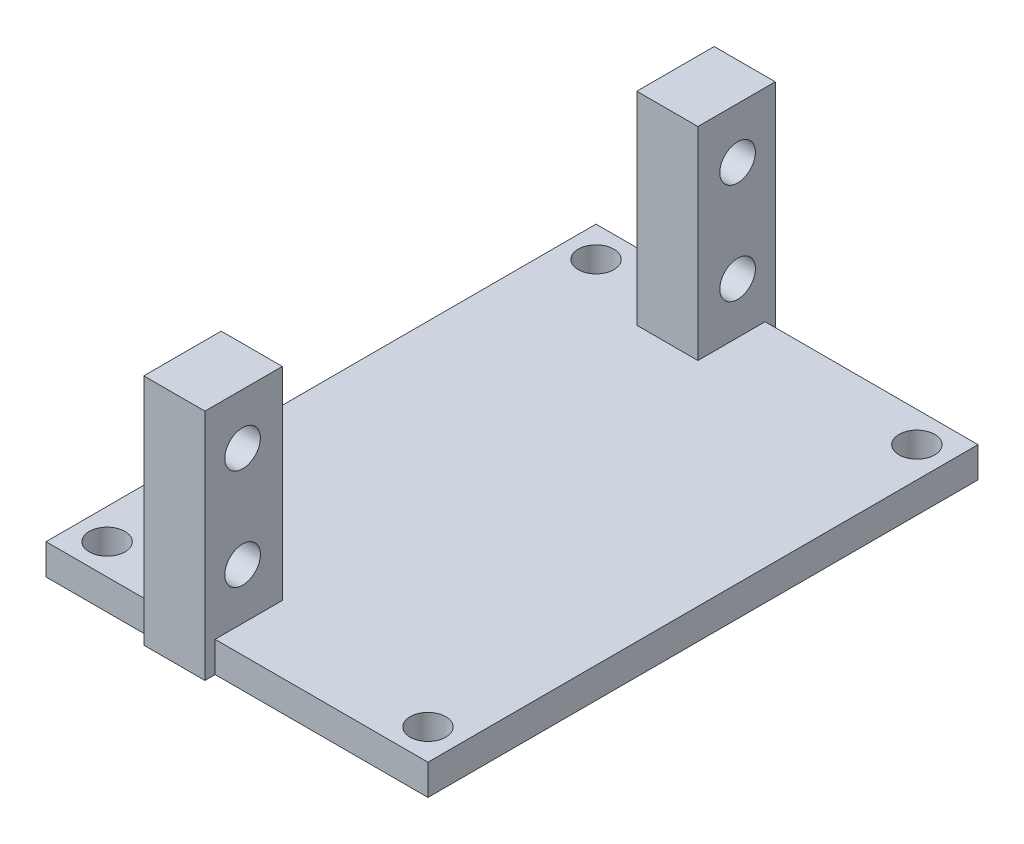
ISO-10303-21;
HEADER;
FILE_DESCRIPTION(('STEP AP214'),'2;1');
FILE_NAME('part.step','',(''),(''),'','','');
FILE_SCHEMA(('AUTOMOTIVE_DESIGN { 1 0 10303 214 1 1 1 1 }'));
ENDSEC;
DATA;
#1=APPLICATION_CONTEXT('core data for automotive mechanical design processes');
#2=APPLICATION_PROTOCOL_DEFINITION('international standard','automotive_design',2000,#1);
#3=PRODUCT_CONTEXT('',#1,'mechanical');
#4=PRODUCT('Part','Part','',(#3));
#5=PRODUCT_RELATED_PRODUCT_CATEGORY('part','',(#4));
#6=PRODUCT_DEFINITION_FORMATION('','',#4);
#7=PRODUCT_DEFINITION_CONTEXT('part definition',#1,'design');
#8=PRODUCT_DEFINITION('design','',#6,#7);
#9=PRODUCT_DEFINITION_SHAPE('','',#8);
#10=(LENGTH_UNIT() NAMED_UNIT(*) SI_UNIT(.MILLI.,.METRE.));
#11=(NAMED_UNIT(*) PLANE_ANGLE_UNIT() SI_UNIT($,.RADIAN.));
#12=(NAMED_UNIT(*) SI_UNIT($,.STERADIAN.) SOLID_ANGLE_UNIT());
#13=UNCERTAINTY_MEASURE_WITH_UNIT(LENGTH_MEASURE(1.E-05),#10,'distance_accuracy_value','');
#14=(GEOMETRIC_REPRESENTATION_CONTEXT(3) GLOBAL_UNCERTAINTY_ASSIGNED_CONTEXT((#13)) GLOBAL_UNIT_ASSIGNED_CONTEXT((#10,
#11,#12)) REPRESENTATION_CONTEXT('',''));
#15=CARTESIAN_POINT('',(0.,0.,0.));
#16=DIRECTION('',(0.,0.,1.));
#17=DIRECTION('',(1.,0.,0.));
#18=AXIS2_PLACEMENT_3D('',#15,#16,#17);
#19=CARTESIAN_POINT('',(-18.75,3.,-27.));
#20=DIRECTION('',(0.,0.,1.));
#21=DIRECTION('',(1.,0.,0.));
#22=AXIS2_PLACEMENT_3D('',#19,#20,#21);
#23=PLANE('',#22);
#24=DIRECTION('',(-1.,0.,0.));
#25=VECTOR('',#24,1.);
#26=CARTESIAN_POINT('',(-18.75,0.,-27.));
#27=LINE('',#26,#25);
#28=CARTESIAN_POINT('',(18.75,0.,-27.));
#29=VERTEX_POINT('',#28);
#30=CARTESIAN_POINT('',(-2.15,0.,-27.));
#31=VERTEX_POINT('',#30);
#32=EDGE_CURVE('E265',#29,#31,#27,.T.);
#33=ORIENTED_EDGE('',*,*,#32,.T.);
#34=DIRECTION('',(0.,1.,0.));
#35=VECTOR('',#34,1.);
#36=CARTESIAN_POINT('',(-2.14999999999999,3.,-27.));
#37=LINE('',#36,#35);
#38=CARTESIAN_POINT('',(-2.15,3.,-27.));
#39=VERTEX_POINT('',#38);
#40=EDGE_CURVE('E204',#31,#39,#37,.T.);
#41=ORIENTED_EDGE('',*,*,#40,.T.);
#42=DIRECTION('',(-1.,0.,0.));
#43=VECTOR('',#42,1.);
#44=CARTESIAN_POINT('',(-18.75,3.,-27.));
#45=LINE('',#44,#43);
#46=CARTESIAN_POINT('',(18.75,3.,-27.));
#47=VERTEX_POINT('',#46);
#48=EDGE_CURVE('E253',#47,#39,#45,.T.);
#49=ORIENTED_EDGE('',*,*,#48,.F.);
#50=DIRECTION('',(0.,-1.,0.));
#51=VECTOR('',#50,1.);
#52=CARTESIAN_POINT('',(18.75,3.,-27.));
#53=LINE('',#52,#51);
#54=EDGE_CURVE('E11',#47,#29,#53,.T.);
#55=ORIENTED_EDGE('',*,*,#54,.T.);
#56=EDGE_LOOP('',(#33,#41,#49,#55));
#57=FACE_BOUND('',#56,.T.);
#58=ADVANCED_FACE('F37',(#57),#23,.F.);
#59=CARTESIAN_POINT('',(-18.75,3.,27.));
#60=DIRECTION('',(0.,0.,-1.));
#61=DIRECTION('',(-1.,0.,0.));
#62=AXIS2_PLACEMENT_3D('',#59,#60,#61);
#63=PLANE('',#62);
#64=DIRECTION('',(1.,0.,0.));
#65=VECTOR('',#64,1.);
#66=CARTESIAN_POINT('',(-18.75,3.,27.));
#67=LINE('',#66,#65);
#68=CARTESIAN_POINT('',(-2.15,3.,27.));
#69=VERTEX_POINT('',#68);
#70=CARTESIAN_POINT('',(18.75,3.,27.));
#71=VERTEX_POINT('',#70);
#72=EDGE_CURVE('E257',#69,#71,#67,.T.);
#73=ORIENTED_EDGE('',*,*,#72,.F.);
#74=DIRECTION('',(0.,-1.,0.));
#75=VECTOR('',#74,1.);
#76=CARTESIAN_POINT('',(-2.15,3.,27.));
#77=LINE('',#76,#75);
#78=CARTESIAN_POINT('',(-2.15,0.,27.));
#79=VERTEX_POINT('',#78);
#80=EDGE_CURVE('E245',#69,#79,#77,.T.);
#81=ORIENTED_EDGE('',*,*,#80,.T.);
#82=DIRECTION('',(1.,0.,0.));
#83=VECTOR('',#82,1.);
#84=CARTESIAN_POINT('',(-18.75,0.,27.));
#85=LINE('',#84,#83);
#86=CARTESIAN_POINT('',(18.75,0.,27.));
#87=VERTEX_POINT('',#86);
#88=EDGE_CURVE('E269',#79,#87,#85,.T.);
#89=ORIENTED_EDGE('',*,*,#88,.T.);
#90=DIRECTION('',(0.,-1.,0.));
#91=VECTOR('',#90,1.);
#92=CARTESIAN_POINT('',(18.75,3.,27.));
#93=LINE('',#92,#91);
#94=EDGE_CURVE('E261',#71,#87,#93,.T.);
#95=ORIENTED_EDGE('',*,*,#94,.F.);
#96=EDGE_LOOP('',(#73,#81,#89,#95));
#97=FACE_BOUND('',#96,.T.);
#98=ADVANCED_FACE('F325',(#97),#63,.F.);
#99=CARTESIAN_POINT('',(18.75,3.,-27.));
#100=DIRECTION('',(-1.,0.,0.));
#101=DIRECTION('',(0.,0.,1.));
#102=AXIS2_PLACEMENT_3D('',#99,#100,#101);
#103=PLANE('',#102);
#104=DIRECTION('',(0.,0.,-1.));
#105=VECTOR('',#104,1.);
#106=CARTESIAN_POINT('',(18.75,0.,-27.));
#107=LINE('',#106,#105);
#108=EDGE_CURVE('E247',#87,#29,#107,.T.);
#109=ORIENTED_EDGE('',*,*,#108,.T.);
#110=ORIENTED_EDGE('',*,*,#54,.F.);
#111=DIRECTION('',(0.,0.,-1.));
#112=VECTOR('',#111,1.);
#113=CARTESIAN_POINT('',(18.75,3.,-27.));
#114=LINE('',#113,#112);
#115=EDGE_CURVE('E248',#71,#47,#114,.T.);
#116=ORIENTED_EDGE('',*,*,#115,.F.);
#117=ORIENTED_EDGE('',*,*,#94,.T.);
#118=EDGE_LOOP('',(#109,#110,#116,#117));
#119=FACE_BOUND('',#118,.T.);
#120=ADVANCED_FACE('F39',(#119),#103,.F.);
#121=CARTESIAN_POINT('',(-8.15,3.,-27.));
#122=VERTEX_POINT('',#121);
#123=CARTESIAN_POINT('',(-18.75,3.,-27.));
#124=VERTEX_POINT('',#123);
#125=EDGE_CURVE('E251',#122,#124,#45,.T.);
#126=ORIENTED_EDGE('',*,*,#125,.F.);
#127=DIRECTION('',(0.,-1.,0.));
#128=VECTOR('',#127,1.);
#129=CARTESIAN_POINT('',(-8.15,3.,-27.));
#130=LINE('',#129,#128);
#131=CARTESIAN_POINT('',(-8.15,0.,-27.));
#132=VERTEX_POINT('',#131);
#133=EDGE_CURVE('E199',#122,#132,#130,.T.);
#134=ORIENTED_EDGE('',*,*,#133,.T.);
#135=CARTESIAN_POINT('',(-18.75,0.,-27.));
#136=VERTEX_POINT('',#135);
#137=EDGE_CURVE('E264',#132,#136,#27,.T.);
#138=ORIENTED_EDGE('',*,*,#137,.T.);
#139=DIRECTION('',(0.,-1.,0.));
#140=VECTOR('',#139,1.);
#141=CARTESIAN_POINT('',(-18.75,3.,-27.));
#142=LINE('',#141,#140);
#143=EDGE_CURVE('E46',#124,#136,#142,.T.);
#144=ORIENTED_EDGE('',*,*,#143,.F.);
#145=EDGE_LOOP('',(#126,#134,#138,#144));
#146=FACE_BOUND('',#145,.T.);
#147=ADVANCED_FACE('F340',(#146),#23,.F.);
#148=CARTESIAN_POINT('',(-18.75,3.,-27.));
#149=DIRECTION('',(1.,0.,0.));
#150=DIRECTION('',(0.,0.,-1.));
#151=AXIS2_PLACEMENT_3D('',#148,#149,#150);
#152=PLANE('',#151);
#153=DIRECTION('',(0.,0.,1.));
#154=VECTOR('',#153,1.);
#155=CARTESIAN_POINT('',(-18.75,0.,-27.));
#156=LINE('',#155,#154);
#157=CARTESIAN_POINT('',(-18.75,0.,27.));
#158=VERTEX_POINT('',#157);
#159=EDGE_CURVE('E267',#136,#158,#156,.T.);
#160=ORIENTED_EDGE('',*,*,#159,.T.);
#161=DIRECTION('',(0.,-1.,0.));
#162=VECTOR('',#161,1.);
#163=CARTESIAN_POINT('',(-18.75,3.,27.));
#164=LINE('',#163,#162);
#165=CARTESIAN_POINT('',(-18.75,3.,27.));
#166=VERTEX_POINT('',#165);
#167=EDGE_CURVE('E273',#166,#158,#164,.T.);
#168=ORIENTED_EDGE('',*,*,#167,.F.);
#169=DIRECTION('',(0.,0.,1.));
#170=VECTOR('',#169,1.);
#171=CARTESIAN_POINT('',(-18.75,3.,-27.));
#172=LINE('',#171,#170);
#173=EDGE_CURVE('E255',#124,#166,#172,.T.);
#174=ORIENTED_EDGE('',*,*,#173,.F.);
#175=ORIENTED_EDGE('',*,*,#143,.T.);
#176=EDGE_LOOP('',(#160,#168,#174,#175));
#177=FACE_BOUND('',#176,.T.);
#178=ADVANCED_FACE('F344',(#177),#152,.F.);
#179=CARTESIAN_POINT('',(-8.15,0.,27.));
#180=VERTEX_POINT('',#179);
#181=EDGE_CURVE('E252',#158,#180,#85,.T.);
#182=ORIENTED_EDGE('',*,*,#181,.T.);
#183=DIRECTION('',(0.,1.,0.));
#184=VECTOR('',#183,1.);
#185=CARTESIAN_POINT('',(-8.14999999999999,3.,27.));
#186=LINE('',#185,#184);
#187=CARTESIAN_POINT('',(-8.15,3.,27.));
#188=VERTEX_POINT('',#187);
#189=EDGE_CURVE('E240',#180,#188,#186,.T.);
#190=ORIENTED_EDGE('',*,*,#189,.T.);
#191=EDGE_CURVE('E258',#166,#188,#67,.T.);
#192=ORIENTED_EDGE('',*,*,#191,.F.);
#193=ORIENTED_EDGE('',*,*,#167,.T.);
#194=EDGE_LOOP('',(#182,#190,#192,#193));
#195=FACE_BOUND('',#194,.T.);
#196=ADVANCED_FACE('F346',(#195),#63,.F.);
#197=CARTESIAN_POINT('',(0.,3.,0.));
#198=DIRECTION('',(0.,1.,0.));
#199=DIRECTION('',(0.,0.,1.));
#200=AXIS2_PLACEMENT_3D('',#197,#198,#199);
#201=PLANE('',#200);
#202=CARTESIAN_POINT('',(15.75,3.,-24.));
#203=DIRECTION('',(0.,1.,0.));
#204=DIRECTION('',(0.,0.,1.));
#205=AXIS2_PLACEMENT_3D('',#202,#203,#204);
#206=CIRCLE('',#205,1.75);
#207=CARTESIAN_POINT('',(15.75,3.,-22.25));
#208=VERTEX_POINT('',#207);
#209=EDGE_CURVE('E568',#208,#208,#206,.T.);
#210=ORIENTED_EDGE('',*,*,#209,.F.);
#211=EDGE_LOOP('',(#210));
#212=FACE_BOUND('',#211,.T.);
#213=CARTESIAN_POINT('',(15.75,3.,24.));
#214=DIRECTION('',(0.,1.,0.));
#215=DIRECTION('',(0.,0.,1.));
#216=AXIS2_PLACEMENT_3D('',#213,#214,#215);
#217=CIRCLE('',#216,1.75);
#218=CARTESIAN_POINT('',(15.75,3.,25.75));
#219=VERTEX_POINT('',#218);
#220=EDGE_CURVE('E570',#219,#219,#217,.T.);
#221=ORIENTED_EDGE('',*,*,#220,.F.);
#222=EDGE_LOOP('',(#221));
#223=FACE_BOUND('',#222,.T.);
#224=CARTESIAN_POINT('',(-15.75,3.,24.));
#225=DIRECTION('',(0.,1.,0.));
#226=DIRECTION('',(0.,0.,1.));
#227=AXIS2_PLACEMENT_3D('',#224,#225,#226);
#228=CIRCLE('',#227,1.75);
#229=CARTESIAN_POINT('',(-15.75,3.,25.75));
#230=VERTEX_POINT('',#229);
#231=EDGE_CURVE('E601',#230,#230,#228,.T.);
#232=ORIENTED_EDGE('',*,*,#231,.F.);
#233=EDGE_LOOP('',(#232));
#234=FACE_BOUND('',#233,.T.);
#235=CARTESIAN_POINT('',(-15.75,3.,-24.));
#236=DIRECTION('',(0.,1.,0.));
#237=DIRECTION('',(0.,0.,1.));
#238=AXIS2_PLACEMENT_3D('',#235,#236,#237);
#239=CIRCLE('',#238,1.75);
#240=CARTESIAN_POINT('',(-15.75,3.,-22.25));
#241=VERTEX_POINT('',#240);
#242=EDGE_CURVE('E578',#241,#241,#239,.T.);
#243=ORIENTED_EDGE('',*,*,#242,.F.);
#244=EDGE_LOOP('',(#243));
#245=FACE_BOUND('',#244,.T.);
#246=DIRECTION('',(0.,0.,-1.));
#247=VECTOR('',#246,1.);
#248=CARTESIAN_POINT('',(-2.15000000000001,3.,0.));
#249=LINE('',#248,#247);
#250=CARTESIAN_POINT('',(-2.15,3.,-20.4));
#251=VERTEX_POINT('',#250);
#252=EDGE_CURVE('E54',#251,#39,#249,.T.);
#253=ORIENTED_EDGE('',*,*,#252,.F.);
#254=DIRECTION('',(1.,0.,0.));
#255=VECTOR('',#254,1.);
#256=CARTESIAN_POINT('',(0.,3.,-20.4));
#257=LINE('',#256,#255);
#258=CARTESIAN_POINT('',(-8.15,3.,-20.4));
#259=VERTEX_POINT('',#258);
#260=EDGE_CURVE('E201',#259,#251,#257,.T.);
#261=ORIENTED_EDGE('',*,*,#260,.F.);
#262=DIRECTION('',(0.,0.,1.));
#263=VECTOR('',#262,1.);
#264=CARTESIAN_POINT('',(-8.15,3.,0.));
#265=LINE('',#264,#263);
#266=EDGE_CURVE('E60',#122,#259,#265,.T.);
#267=ORIENTED_EDGE('',*,*,#266,.F.);
#268=ORIENTED_EDGE('',*,*,#125,.T.);
#269=ORIENTED_EDGE('',*,*,#173,.T.);
#270=ORIENTED_EDGE('',*,*,#191,.T.);
#271=DIRECTION('',(0.,0.,1.));
#272=VECTOR('',#271,1.);
#273=CARTESIAN_POINT('',(-8.15000000000001,3.,0.));
#274=LINE('',#273,#272);
#275=CARTESIAN_POINT('',(-8.15,3.,20.4));
#276=VERTEX_POINT('',#275);
#277=EDGE_CURVE('E237',#276,#188,#274,.T.);
#278=ORIENTED_EDGE('',*,*,#277,.F.);
#279=DIRECTION('',(-1.,0.,0.));
#280=VECTOR('',#279,1.);
#281=CARTESIAN_POINT('',(0.,3.,20.4));
#282=LINE('',#281,#280);
#283=CARTESIAN_POINT('',(-2.15,3.,20.4));
#284=VERTEX_POINT('',#283);
#285=EDGE_CURVE('E229',#284,#276,#282,.T.);
#286=ORIENTED_EDGE('',*,*,#285,.F.);
#287=DIRECTION('',(0.,0.,-1.));
#288=VECTOR('',#287,1.);
#289=CARTESIAN_POINT('',(-2.15000000000001,3.,0.));
#290=LINE('',#289,#288);
#291=EDGE_CURVE('E242',#69,#284,#290,.T.);
#292=ORIENTED_EDGE('',*,*,#291,.F.);
#293=ORIENTED_EDGE('',*,*,#72,.T.);
#294=ORIENTED_EDGE('',*,*,#115,.T.);
#295=ORIENTED_EDGE('',*,*,#48,.T.);
#296=EDGE_LOOP('',(#253,#261,#267,#268,#269,#270,#278,#286,#292,#293,#294,#295));
#297=FACE_BOUND('',#296,.T.);
#298=ADVANCED_FACE('F320',(#212,#223,#234,#245,#297),#201,.T.);
#299=CARTESIAN_POINT('',(0.,0.,0.));
#300=DIRECTION('',(0.,1.,0.));
#301=DIRECTION('',(0.,0.,1.));
#302=AXIS2_PLACEMENT_3D('',#299,#300,#301);
#303=PLANE('',#302);
#304=CARTESIAN_POINT('',(15.75,0.,-24.));
#305=DIRECTION('',(0.,1.,0.));
#306=DIRECTION('',(0.,0.,1.));
#307=AXIS2_PLACEMENT_3D('',#304,#305,#306);
#308=CIRCLE('',#307,1.75);
#309=CARTESIAN_POINT('',(15.75,0.,-22.25));
#310=VERTEX_POINT('',#309);
#311=EDGE_CURVE('E565',#310,#310,#308,.T.);
#312=ORIENTED_EDGE('',*,*,#311,.T.);
#313=EDGE_LOOP('',(#312));
#314=FACE_BOUND('',#313,.T.);
#315=CARTESIAN_POINT('',(15.75,0.,24.));
#316=DIRECTION('',(0.,1.,0.));
#317=DIRECTION('',(0.,0.,1.));
#318=AXIS2_PLACEMENT_3D('',#315,#316,#317);
#319=CIRCLE('',#318,1.75);
#320=CARTESIAN_POINT('',(15.75,0.,25.75));
#321=VERTEX_POINT('',#320);
#322=EDGE_CURVE('E606',#321,#321,#319,.T.);
#323=ORIENTED_EDGE('',*,*,#322,.T.);
#324=EDGE_LOOP('',(#323));
#325=FACE_BOUND('',#324,.T.);
#326=CARTESIAN_POINT('',(-15.75,0.,24.));
#327=DIRECTION('',(0.,1.,0.));
#328=DIRECTION('',(0.,0.,1.));
#329=AXIS2_PLACEMENT_3D('',#326,#327,#328);
#330=CIRCLE('',#329,1.75);
#331=CARTESIAN_POINT('',(-15.75,0.,25.75));
#332=VERTEX_POINT('',#331);
#333=EDGE_CURVE('E581',#332,#332,#330,.T.);
#334=ORIENTED_EDGE('',*,*,#333,.T.);
#335=EDGE_LOOP('',(#334));
#336=FACE_BOUND('',#335,.T.);
#337=CARTESIAN_POINT('',(-15.75,0.,-24.));
#338=DIRECTION('',(0.,1.,0.));
#339=DIRECTION('',(0.,0.,1.));
#340=AXIS2_PLACEMENT_3D('',#337,#338,#339);
#341=CIRCLE('',#340,1.75);
#342=CARTESIAN_POINT('',(-15.75,0.,-22.25));
#343=VERTEX_POINT('',#342);
#344=EDGE_CURVE('E574',#343,#343,#341,.T.);
#345=ORIENTED_EDGE('',*,*,#344,.T.);
#346=EDGE_LOOP('',(#345));
#347=FACE_BOUND('',#346,.T.);
#348=ORIENTED_EDGE('',*,*,#137,.F.);
#349=DIRECTION('',(0.,0.,1.));
#350=VECTOR('',#349,1.);
#351=CARTESIAN_POINT('',(-8.15,0.,-28.));
#352=LINE('',#351,#350);
#353=CARTESIAN_POINT('',(-8.15,0.,-28.));
#354=VERTEX_POINT('',#353);
#355=EDGE_CURVE('E165',#354,#132,#352,.T.);
#356=ORIENTED_EDGE('',*,*,#355,.F.);
#357=DIRECTION('',(-1.,0.,0.));
#358=VECTOR('',#357,1.);
#359=CARTESIAN_POINT('',(-2.14999999999999,0.,-28.));
#360=LINE('',#359,#358);
#361=CARTESIAN_POINT('',(-2.14999999999999,0.,-28.));
#362=VERTEX_POINT('',#361);
#363=EDGE_CURVE('E189',#362,#354,#360,.T.);
#364=ORIENTED_EDGE('',*,*,#363,.F.);
#365=DIRECTION('',(0.,0.,-1.));
#366=VECTOR('',#365,1.);
#367=CARTESIAN_POINT('',(-2.14999999999999,0.,-28.));
#368=LINE('',#367,#366);
#369=EDGE_CURVE('E160',#31,#362,#368,.T.);
#370=ORIENTED_EDGE('',*,*,#369,.F.);
#371=ORIENTED_EDGE('',*,*,#32,.F.);
#372=ORIENTED_EDGE('',*,*,#108,.F.);
#373=ORIENTED_EDGE('',*,*,#88,.F.);
#374=DIRECTION('',(0.,0.,-1.));
#375=VECTOR('',#374,1.);
#376=CARTESIAN_POINT('',(-2.14999999999999,0.,28.));
#377=LINE('',#376,#375);
#378=CARTESIAN_POINT('',(-2.14999999999999,0.,28.));
#379=VERTEX_POINT('',#378);
#380=EDGE_CURVE('E218',#379,#79,#377,.T.);
#381=ORIENTED_EDGE('',*,*,#380,.F.);
#382=DIRECTION('',(1.,0.,0.));
#383=VECTOR('',#382,1.);
#384=CARTESIAN_POINT('',(-2.14999999999999,0.,28.));
#385=LINE('',#384,#383);
#386=CARTESIAN_POINT('',(-8.14999999999999,0.,28.));
#387=VERTEX_POINT('',#386);
#388=EDGE_CURVE('E223',#387,#379,#385,.T.);
#389=ORIENTED_EDGE('',*,*,#388,.F.);
#390=DIRECTION('',(0.,0.,1.));
#391=VECTOR('',#390,1.);
#392=CARTESIAN_POINT('',(-8.14999999999999,0.,28.));
#393=LINE('',#392,#391);
#394=EDGE_CURVE('E221',#180,#387,#393,.T.);
#395=ORIENTED_EDGE('',*,*,#394,.F.);
#396=ORIENTED_EDGE('',*,*,#181,.F.);
#397=ORIENTED_EDGE('',*,*,#159,.F.);
#398=EDGE_LOOP('',(#348,#356,#364,#370,#371,#372,#373,#381,#389,#395,#396,#397));
#399=FACE_BOUND('',#398,.T.);
#400=ADVANCED_FACE('F306',(#314,#325,#336,#347,#399),#303,.F.);
#401=CARTESIAN_POINT('',(-2.14999999999999,0.,28.));
#402=DIRECTION('',(1.,0.,0.));
#403=DIRECTION('',(0.,0.,-1.));
#404=AXIS2_PLACEMENT_3D('',#401,#402,#403);
#405=PLANE('',#404);
#406=CARTESIAN_POINT('',(-2.15000000000001,8.,24.3));
#407=DIRECTION('',(1.,0.,0.));
#408=DIRECTION('',(0.,0.,-1.));
#409=AXIS2_PLACEMENT_3D('',#406,#407,#408);
#410=CIRCLE('',#409,1.75);
#411=CARTESIAN_POINT('',(-2.15000000000001,8.,22.55));
#412=VERTEX_POINT('',#411);
#413=EDGE_CURVE('E582',#412,#412,#410,.T.);
#414=ORIENTED_EDGE('',*,*,#413,.F.);
#415=EDGE_LOOP('',(#414));
#416=FACE_BOUND('',#415,.T.);
#417=CARTESIAN_POINT('',(-2.15000000000001,17.9,24.3));
#418=DIRECTION('',(1.,0.,0.));
#419=DIRECTION('',(0.,0.,-1.));
#420=AXIS2_PLACEMENT_3D('',#417,#418,#419);
#421=CIRCLE('',#420,1.75);
#422=CARTESIAN_POINT('',(-2.15000000000001,17.9,22.55));
#423=VERTEX_POINT('',#422);
#424=EDGE_CURVE('E183',#423,#423,#421,.T.);
#425=ORIENTED_EDGE('',*,*,#424,.F.);
#426=EDGE_LOOP('',(#425));
#427=FACE_BOUND('',#426,.T.);
#428=ORIENTED_EDGE('',*,*,#80,.F.);
#429=ORIENTED_EDGE('',*,*,#291,.T.);
#430=DIRECTION('',(0.,1.,0.));
#431=VECTOR('',#430,1.);
#432=CARTESIAN_POINT('',(-2.15,0.,20.4));
#433=LINE('',#432,#431);
#434=CARTESIAN_POINT('',(-2.15,22.9,20.4));
#435=VERTEX_POINT('',#434);
#436=EDGE_CURVE('E226',#284,#435,#433,.T.);
#437=ORIENTED_EDGE('',*,*,#436,.T.);
#438=DIRECTION('',(0.,0.,-1.));
#439=VECTOR('',#438,1.);
#440=CARTESIAN_POINT('',(-2.14999999999999,22.9,28.));
#441=LINE('',#440,#439);
#442=CARTESIAN_POINT('',(-2.14999999999999,22.9,28.));
#443=VERTEX_POINT('',#442);
#444=EDGE_CURVE('E206',#443,#435,#441,.T.);
#445=ORIENTED_EDGE('',*,*,#444,.F.);
#446=DIRECTION('',(0.,1.,0.));
#447=VECTOR('',#446,1.);
#448=CARTESIAN_POINT('',(-2.14999999999999,0.,28.));
#449=LINE('',#448,#447);
#450=EDGE_CURVE('E227',#379,#443,#449,.T.);
#451=ORIENTED_EDGE('',*,*,#450,.F.);
#452=ORIENTED_EDGE('',*,*,#380,.T.);
#453=EDGE_LOOP('',(#428,#429,#437,#445,#451,#452));
#454=FACE_BOUND('',#453,.T.);
#455=ADVANCED_FACE('F293',(#416,#427,#454),#405,.T.);
#456=CARTESIAN_POINT('',(-8.14999999999999,0.,28.));
#457=DIRECTION('',(-1.,0.,0.));
#458=DIRECTION('',(0.,0.,1.));
#459=AXIS2_PLACEMENT_3D('',#456,#457,#458);
#460=PLANE('',#459);
#461=CARTESIAN_POINT('',(-8.15,8.,24.3));
#462=DIRECTION('',(-1.,0.,0.));
#463=DIRECTION('',(0.,0.,1.));
#464=AXIS2_PLACEMENT_3D('',#461,#462,#463);
#465=CIRCLE('',#464,1.75);
#466=CARTESIAN_POINT('',(-8.15,8.,26.05));
#467=VERTEX_POINT('',#466);
#468=EDGE_CURVE('E41',#467,#467,#465,.T.);
#469=ORIENTED_EDGE('',*,*,#468,.F.);
#470=EDGE_LOOP('',(#469));
#471=FACE_BOUND('',#470,.T.);
#472=CARTESIAN_POINT('',(-8.15,17.9,24.3));
#473=DIRECTION('',(-1.,0.,0.));
#474=DIRECTION('',(0.,0.,1.));
#475=AXIS2_PLACEMENT_3D('',#472,#473,#474);
#476=CIRCLE('',#475,1.75);
#477=CARTESIAN_POINT('',(-8.15,17.9,26.05));
#478=VERTEX_POINT('',#477);
#479=EDGE_CURVE('E181',#478,#478,#476,.T.);
#480=ORIENTED_EDGE('',*,*,#479,.F.);
#481=EDGE_LOOP('',(#480));
#482=FACE_BOUND('',#481,.T.);
#483=ORIENTED_EDGE('',*,*,#189,.F.);
#484=ORIENTED_EDGE('',*,*,#394,.T.);
#485=DIRECTION('',(0.,1.,0.));
#486=VECTOR('',#485,1.);
#487=CARTESIAN_POINT('',(-8.14999999999999,0.,28.));
#488=LINE('',#487,#486);
#489=CARTESIAN_POINT('',(-8.14999999999999,22.9,28.));
#490=VERTEX_POINT('',#489);
#491=EDGE_CURVE('E230',#387,#490,#488,.T.);
#492=ORIENTED_EDGE('',*,*,#491,.T.);
#493=DIRECTION('',(0.,0.,1.));
#494=VECTOR('',#493,1.);
#495=CARTESIAN_POINT('',(-8.14999999999999,22.9,28.));
#496=LINE('',#495,#494);
#497=CARTESIAN_POINT('',(-8.15,22.9,20.4));
#498=VERTEX_POINT('',#497);
#499=EDGE_CURVE('E212',#498,#490,#496,.T.);
#500=ORIENTED_EDGE('',*,*,#499,.F.);
#501=DIRECTION('',(0.,1.,0.));
#502=VECTOR('',#501,1.);
#503=CARTESIAN_POINT('',(-8.15,0.,20.4));
#504=LINE('',#503,#502);
#505=EDGE_CURVE('E232',#276,#498,#504,.T.);
#506=ORIENTED_EDGE('',*,*,#505,.F.);
#507=ORIENTED_EDGE('',*,*,#277,.T.);
#508=EDGE_LOOP('',(#483,#484,#492,#500,#506,#507));
#509=FACE_BOUND('',#508,.T.);
#510=ADVANCED_FACE('F289',(#471,#482,#509),#460,.T.);
#511=CARTESIAN_POINT('',(-2.14999999999999,0.,28.));
#512=DIRECTION('',(0.,0.,1.));
#513=DIRECTION('',(1.,0.,0.));
#514=AXIS2_PLACEMENT_3D('',#511,#512,#513);
#515=PLANE('',#514);
#516=ORIENTED_EDGE('',*,*,#450,.T.);
#517=DIRECTION('',(1.,0.,0.));
#518=VECTOR('',#517,1.);
#519=CARTESIAN_POINT('',(-2.14999999999999,22.9,28.));
#520=LINE('',#519,#518);
#521=EDGE_CURVE('E215',#490,#443,#520,.T.);
#522=ORIENTED_EDGE('',*,*,#521,.F.);
#523=ORIENTED_EDGE('',*,*,#491,.F.);
#524=ORIENTED_EDGE('',*,*,#388,.T.);
#525=EDGE_LOOP('',(#516,#522,#523,#524));
#526=FACE_BOUND('',#525,.T.);
#527=ADVANCED_FACE('F292',(#526),#515,.T.);
#528=CARTESIAN_POINT('',(-2.15,0.,20.4));
#529=DIRECTION('',(0.,0.,-1.));
#530=DIRECTION('',(-1.,0.,0.));
#531=AXIS2_PLACEMENT_3D('',#528,#529,#530);
#532=PLANE('',#531);
#533=ORIENTED_EDGE('',*,*,#436,.F.);
#534=ORIENTED_EDGE('',*,*,#285,.T.);
#535=ORIENTED_EDGE('',*,*,#505,.T.);
#536=DIRECTION('',(-1.,0.,0.));
#537=VECTOR('',#536,1.);
#538=CARTESIAN_POINT('',(-2.15,22.9,20.4));
#539=LINE('',#538,#537);
#540=EDGE_CURVE('E209',#435,#498,#539,.T.);
#541=ORIENTED_EDGE('',*,*,#540,.F.);
#542=EDGE_LOOP('',(#533,#534,#535,#541));
#543=FACE_BOUND('',#542,.T.);
#544=ADVANCED_FACE('F319',(#543),#532,.T.);
#545=CARTESIAN_POINT('',(0.,22.9,0.));
#546=DIRECTION('',(0.,1.,0.));
#547=DIRECTION('',(0.,0.,1.));
#548=AXIS2_PLACEMENT_3D('',#545,#546,#547);
#549=PLANE('',#548);
#550=ORIENTED_EDGE('',*,*,#444,.T.);
#551=ORIENTED_EDGE('',*,*,#540,.T.);
#552=ORIENTED_EDGE('',*,*,#499,.T.);
#553=ORIENTED_EDGE('',*,*,#521,.T.);
#554=EDGE_LOOP('',(#550,#551,#552,#553));
#555=FACE_BOUND('',#554,.T.);
#556=ADVANCED_FACE('F314',(#555),#549,.T.);
#557=CARTESIAN_POINT('',(-2.14999999999999,0.,-28.));
#558=DIRECTION('',(1.,0.,0.));
#559=DIRECTION('',(0.,0.,-1.));
#560=AXIS2_PLACEMENT_3D('',#557,#558,#559);
#561=PLANE('',#560);
#562=CARTESIAN_POINT('',(-2.15000000000001,17.9,-24.3));
#563=DIRECTION('',(1.,0.,0.));
#564=DIRECTION('',(0.,0.,-1.));
#565=AXIS2_PLACEMENT_3D('',#562,#563,#564);
#566=CIRCLE('',#565,1.75);
#567=CARTESIAN_POINT('',(-2.15000000000001,17.9,-26.05));
#568=VERTEX_POINT('',#567);
#569=EDGE_CURVE('E577',#568,#568,#566,.T.);
#570=ORIENTED_EDGE('',*,*,#569,.F.);
#571=EDGE_LOOP('',(#570));
#572=FACE_BOUND('',#571,.T.);
#573=CARTESIAN_POINT('',(-2.15000000000001,8.,-24.3));
#574=DIRECTION('',(1.,0.,0.));
#575=DIRECTION('',(0.,0.,-1.));
#576=AXIS2_PLACEMENT_3D('',#573,#574,#575);
#577=CIRCLE('',#576,1.75);
#578=CARTESIAN_POINT('',(-2.15000000000001,8.,-26.05));
#579=VERTEX_POINT('',#578);
#580=EDGE_CURVE('E585',#579,#579,#577,.T.);
#581=ORIENTED_EDGE('',*,*,#580,.F.);
#582=EDGE_LOOP('',(#581));
#583=FACE_BOUND('',#582,.T.);
#584=ORIENTED_EDGE('',*,*,#40,.F.);
#585=ORIENTED_EDGE('',*,*,#369,.T.);
#586=DIRECTION('',(0.,1.,0.));
#587=VECTOR('',#586,1.);
#588=CARTESIAN_POINT('',(-2.14999999999999,0.,-28.));
#589=LINE('',#588,#587);
#590=CARTESIAN_POINT('',(-2.14999999999999,22.9,-28.));
#591=VERTEX_POINT('',#590);
#592=EDGE_CURVE('E152',#362,#591,#589,.T.);
#593=ORIENTED_EDGE('',*,*,#592,.T.);
#594=DIRECTION('',(0.,0.,-1.));
#595=VECTOR('',#594,1.);
#596=CARTESIAN_POINT('',(-2.14999999999999,22.9,-28.));
#597=LINE('',#596,#595);
#598=CARTESIAN_POINT('',(-2.15,22.9,-20.4));
#599=VERTEX_POINT('',#598);
#600=EDGE_CURVE('E158',#599,#591,#597,.T.);
#601=ORIENTED_EDGE('',*,*,#600,.F.);
#602=DIRECTION('',(0.,1.,0.));
#603=VECTOR('',#602,1.);
#604=CARTESIAN_POINT('',(-2.15,0.,-20.4));
#605=LINE('',#604,#603);
#606=EDGE_CURVE('E193',#251,#599,#605,.T.);
#607=ORIENTED_EDGE('',*,*,#606,.F.);
#608=ORIENTED_EDGE('',*,*,#252,.T.);
#609=EDGE_LOOP('',(#584,#585,#593,#601,#607,#608));
#610=FACE_BOUND('',#609,.T.);
#611=ADVANCED_FACE('F155',(#572,#583,#610),#561,.T.);
#612=CARTESIAN_POINT('',(-8.15,0.,-28.));
#613=DIRECTION('',(-1.,0.,0.));
#614=DIRECTION('',(0.,0.,1.));
#615=AXIS2_PLACEMENT_3D('',#612,#613,#614);
#616=PLANE('',#615);
#617=CARTESIAN_POINT('',(-8.15,17.9,-24.3));
#618=DIRECTION('',(-1.,0.,0.));
#619=DIRECTION('',(0.,0.,1.));
#620=AXIS2_PLACEMENT_3D('',#617,#618,#619);
#621=CIRCLE('',#620,1.75);
#622=CARTESIAN_POINT('',(-8.15,17.9,-22.55));
#623=VERTEX_POINT('',#622);
#624=EDGE_CURVE('E281',#623,#623,#621,.T.);
#625=ORIENTED_EDGE('',*,*,#624,.F.);
#626=EDGE_LOOP('',(#625));
#627=FACE_BOUND('',#626,.T.);
#628=CARTESIAN_POINT('',(-8.15,8.,-24.3));
#629=DIRECTION('',(-1.,0.,0.));
#630=DIRECTION('',(0.,0.,1.));
#631=AXIS2_PLACEMENT_3D('',#628,#629,#630);
#632=CIRCLE('',#631,1.75);
#633=CARTESIAN_POINT('',(-8.15,8.,-22.55));
#634=VERTEX_POINT('',#633);
#635=EDGE_CURVE('E278',#634,#634,#632,.T.);
#636=ORIENTED_EDGE('',*,*,#635,.F.);
#637=EDGE_LOOP('',(#636));
#638=FACE_BOUND('',#637,.T.);
#639=ORIENTED_EDGE('',*,*,#133,.F.);
#640=ORIENTED_EDGE('',*,*,#266,.T.);
#641=DIRECTION('',(0.,1.,0.));
#642=VECTOR('',#641,1.);
#643=CARTESIAN_POINT('',(-8.15,0.,-20.4));
#644=LINE('',#643,#642);
#645=CARTESIAN_POINT('',(-8.15,22.9,-20.4));
#646=VERTEX_POINT('',#645);
#647=EDGE_CURVE('E195',#259,#646,#644,.T.);
#648=ORIENTED_EDGE('',*,*,#647,.T.);
#649=DIRECTION('',(0.,0.,1.));
#650=VECTOR('',#649,1.);
#651=CARTESIAN_POINT('',(-8.15,22.9,-28.));
#652=LINE('',#651,#650);
#653=CARTESIAN_POINT('',(-8.15,22.9,-28.));
#654=VERTEX_POINT('',#653);
#655=EDGE_CURVE('E173',#654,#646,#652,.T.);
#656=ORIENTED_EDGE('',*,*,#655,.F.);
#657=DIRECTION('',(0.,1.,0.));
#658=VECTOR('',#657,1.);
#659=CARTESIAN_POINT('',(-8.15,0.,-28.));
#660=LINE('',#659,#658);
#661=EDGE_CURVE('E164',#354,#654,#660,.T.);
#662=ORIENTED_EDGE('',*,*,#661,.F.);
#663=ORIENTED_EDGE('',*,*,#355,.T.);
#664=EDGE_LOOP('',(#639,#640,#648,#656,#662,#663));
#665=FACE_BOUND('',#664,.T.);
#666=ADVANCED_FACE('F337',(#627,#638,#665),#616,.T.);
#667=CARTESIAN_POINT('',(-2.15,0.,-20.4));
#668=DIRECTION('',(0.,0.,1.));
#669=DIRECTION('',(1.,0.,0.));
#670=AXIS2_PLACEMENT_3D('',#667,#668,#669);
#671=PLANE('',#670);
#672=ORIENTED_EDGE('',*,*,#647,.F.);
#673=ORIENTED_EDGE('',*,*,#260,.T.);
#674=ORIENTED_EDGE('',*,*,#606,.T.);
#675=DIRECTION('',(1.,0.,0.));
#676=VECTOR('',#675,1.);
#677=CARTESIAN_POINT('',(-2.15,22.9,-20.4));
#678=LINE('',#677,#676);
#679=EDGE_CURVE('E178',#646,#599,#678,.T.);
#680=ORIENTED_EDGE('',*,*,#679,.F.);
#681=EDGE_LOOP('',(#672,#673,#674,#680));
#682=FACE_BOUND('',#681,.T.);
#683=ADVANCED_FACE('F334',(#682),#671,.T.);
#684=CARTESIAN_POINT('',(-2.14999999999999,0.,-28.));
#685=DIRECTION('',(0.,0.,-1.));
#686=DIRECTION('',(-1.,0.,0.));
#687=AXIS2_PLACEMENT_3D('',#684,#685,#686);
#688=PLANE('',#687);
#689=ORIENTED_EDGE('',*,*,#661,.T.);
#690=DIRECTION('',(-1.,0.,0.));
#691=VECTOR('',#690,1.);
#692=CARTESIAN_POINT('',(-2.14999999999999,22.9,-28.));
#693=LINE('',#692,#691);
#694=EDGE_CURVE('E168',#591,#654,#693,.T.);
#695=ORIENTED_EDGE('',*,*,#694,.F.);
#696=ORIENTED_EDGE('',*,*,#592,.F.);
#697=ORIENTED_EDGE('',*,*,#363,.T.);
#698=EDGE_LOOP('',(#689,#695,#696,#697));
#699=FACE_BOUND('',#698,.T.);
#700=ADVANCED_FACE('F169',(#699),#688,.T.);
#701=CARTESIAN_POINT('',(0.,22.9,0.));
#702=DIRECTION('',(0.,-1.,0.));
#703=DIRECTION('',(0.,0.,-1.));
#704=AXIS2_PLACEMENT_3D('',#701,#702,#703);
#705=PLANE('',#704);
#706=ORIENTED_EDGE('',*,*,#600,.T.);
#707=ORIENTED_EDGE('',*,*,#694,.T.);
#708=ORIENTED_EDGE('',*,*,#655,.T.);
#709=ORIENTED_EDGE('',*,*,#679,.T.);
#710=EDGE_LOOP('',(#706,#707,#708,#709));
#711=FACE_BOUND('',#710,.T.);
#712=ADVANCED_FACE('F176',(#711),#705,.F.);
#713=CARTESIAN_POINT('',(-18.75,8.,-24.3));
#714=DIRECTION('',(1.,0.,0.));
#715=DIRECTION('',(0.,0.,-1.));
#716=AXIS2_PLACEMENT_3D('',#713,#714,#715);
#717=CYLINDRICAL_SURFACE('',#716,1.75);
#718=ORIENTED_EDGE('',*,*,#635,.T.);
#719=EDGE_LOOP('',(#718));
#720=FACE_BOUND('',#719,.T.);
#721=ORIENTED_EDGE('',*,*,#580,.T.);
#722=EDGE_LOOP('',(#721));
#723=FACE_BOUND('',#722,.T.);
#724=ADVANCED_FACE('F439',(#720,#723),#717,.F.);
#725=CARTESIAN_POINT('',(-18.75,17.9,-24.3));
#726=DIRECTION('',(1.,0.,0.));
#727=DIRECTION('',(0.,0.,-1.));
#728=AXIS2_PLACEMENT_3D('',#725,#726,#727);
#729=CYLINDRICAL_SURFACE('',#728,1.75);
#730=ORIENTED_EDGE('',*,*,#624,.T.);
#731=EDGE_LOOP('',(#730));
#732=FACE_BOUND('',#731,.T.);
#733=ORIENTED_EDGE('',*,*,#569,.T.);
#734=EDGE_LOOP('',(#733));
#735=FACE_BOUND('',#734,.T.);
#736=ADVANCED_FACE('F478',(#732,#735),#729,.F.);
#737=CARTESIAN_POINT('',(-18.75,17.9,24.3));
#738=DIRECTION('',(1.,0.,0.));
#739=DIRECTION('',(0.,0.,-1.));
#740=AXIS2_PLACEMENT_3D('',#737,#738,#739);
#741=CYLINDRICAL_SURFACE('',#740,1.75);
#742=ORIENTED_EDGE('',*,*,#479,.T.);
#743=EDGE_LOOP('',(#742));
#744=FACE_BOUND('',#743,.T.);
#745=ORIENTED_EDGE('',*,*,#424,.T.);
#746=EDGE_LOOP('',(#745));
#747=FACE_BOUND('',#746,.T.);
#748=ADVANCED_FACE('F286',(#744,#747),#741,.F.);
#749=CARTESIAN_POINT('',(-18.75,8.,24.3));
#750=DIRECTION('',(1.,0.,0.));
#751=DIRECTION('',(0.,0.,-1.));
#752=AXIS2_PLACEMENT_3D('',#749,#750,#751);
#753=CYLINDRICAL_SURFACE('',#752,1.75);
#754=ORIENTED_EDGE('',*,*,#468,.T.);
#755=EDGE_LOOP('',(#754));
#756=FACE_BOUND('',#755,.T.);
#757=ORIENTED_EDGE('',*,*,#413,.T.);
#758=EDGE_LOOP('',(#757));
#759=FACE_BOUND('',#758,.T.);
#760=ADVANCED_FACE('F497',(#756,#759),#753,.F.);
#761=CARTESIAN_POINT('',(-15.75,0.,-24.));
#762=DIRECTION('',(0.,1.,0.));
#763=DIRECTION('',(0.,0.,1.));
#764=AXIS2_PLACEMENT_3D('',#761,#762,#763);
#765=CYLINDRICAL_SURFACE('',#764,1.75);
#766=ORIENTED_EDGE('',*,*,#344,.F.);
#767=EDGE_LOOP('',(#766));
#768=FACE_BOUND('',#767,.T.);
#769=ORIENTED_EDGE('',*,*,#242,.T.);
#770=EDGE_LOOP('',(#769));
#771=FACE_BOUND('',#770,.T.);
#772=ADVANCED_FACE('F506',(#768,#771),#765,.F.);
#773=CARTESIAN_POINT('',(-15.75,0.,24.));
#774=DIRECTION('',(0.,1.,0.));
#775=DIRECTION('',(0.,0.,1.));
#776=AXIS2_PLACEMENT_3D('',#773,#774,#775);
#777=CYLINDRICAL_SURFACE('',#776,1.75);
#778=ORIENTED_EDGE('',*,*,#333,.F.);
#779=EDGE_LOOP('',(#778));
#780=FACE_BOUND('',#779,.T.);
#781=ORIENTED_EDGE('',*,*,#231,.T.);
#782=EDGE_LOOP('',(#781));
#783=FACE_BOUND('',#782,.T.);
#784=ADVANCED_FACE('F528',(#780,#783),#777,.F.);
#785=CARTESIAN_POINT('',(15.75,0.,24.));
#786=DIRECTION('',(0.,1.,0.));
#787=DIRECTION('',(0.,0.,1.));
#788=AXIS2_PLACEMENT_3D('',#785,#786,#787);
#789=CYLINDRICAL_SURFACE('',#788,1.75);
#790=ORIENTED_EDGE('',*,*,#322,.F.);
#791=EDGE_LOOP('',(#790));
#792=FACE_BOUND('',#791,.T.);
#793=ORIENTED_EDGE('',*,*,#220,.T.);
#794=EDGE_LOOP('',(#793));
#795=FACE_BOUND('',#794,.T.);
#796=ADVANCED_FACE('F538',(#792,#795),#789,.F.);
#797=CARTESIAN_POINT('',(15.75,0.,-24.));
#798=DIRECTION('',(0.,1.,0.));
#799=DIRECTION('',(0.,0.,1.));
#800=AXIS2_PLACEMENT_3D('',#797,#798,#799);
#801=CYLINDRICAL_SURFACE('',#800,1.75);
#802=ORIENTED_EDGE('',*,*,#311,.F.);
#803=EDGE_LOOP('',(#802));
#804=FACE_BOUND('',#803,.T.);
#805=ORIENTED_EDGE('',*,*,#209,.T.);
#806=EDGE_LOOP('',(#805));
#807=FACE_BOUND('',#806,.T.);
#808=ADVANCED_FACE('F548',(#804,#807),#801,.F.);
#809=CLOSED_SHELL('',(#58,#98,#120,#147,#178,#196,#298,#400,#455,#510,#527,#544,#556,#611,#666,
#683,#700,#712,#724,#736,#748,#760,#772,#784,#796,#808));
#810=MANIFOLD_SOLID_BREP('B2',#809);
#811=ADVANCED_BREP_SHAPE_REPRESENTATION('',(#18,#810),#14);
#812=SHAPE_DEFINITION_REPRESENTATION(#9,#811);
ENDSEC;
END-ISO-10303-21;
